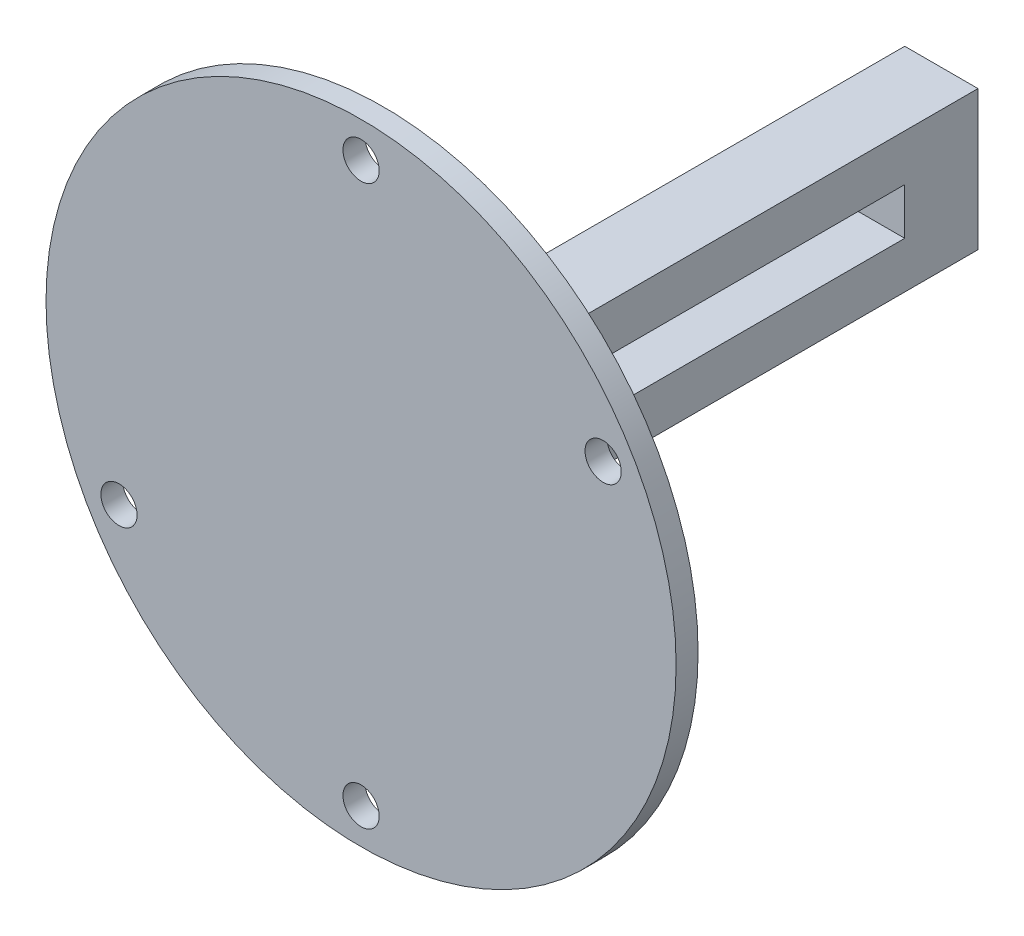
ISO-10303-21;
HEADER;
FILE_DESCRIPTION(('STEP AP214'),'2;1');
FILE_NAME('part.step','',(''),(''),'','','');
FILE_SCHEMA(('AUTOMOTIVE_DESIGN { 1 0 10303 214 1 1 1 1 }'));
ENDSEC;
DATA;
#1=APPLICATION_CONTEXT('core data for automotive mechanical design processes');
#2=APPLICATION_PROTOCOL_DEFINITION('international standard','automotive_design',2000,#1);
#3=PRODUCT_CONTEXT('',#1,'mechanical');
#4=PRODUCT('Part','Part','',(#3));
#5=PRODUCT_RELATED_PRODUCT_CATEGORY('part','',(#4));
#6=PRODUCT_DEFINITION_FORMATION('','',#4);
#7=PRODUCT_DEFINITION_CONTEXT('part definition',#1,'design');
#8=PRODUCT_DEFINITION('design','',#6,#7);
#9=PRODUCT_DEFINITION_SHAPE('','',#8);
#10=(LENGTH_UNIT() NAMED_UNIT(*) SI_UNIT(.MILLI.,.METRE.));
#11=(NAMED_UNIT(*) PLANE_ANGLE_UNIT() SI_UNIT($,.RADIAN.));
#12=(NAMED_UNIT(*) SI_UNIT($,.STERADIAN.) SOLID_ANGLE_UNIT());
#13=UNCERTAINTY_MEASURE_WITH_UNIT(LENGTH_MEASURE(1.E-05),#10,'distance_accuracy_value','');
#14=(GEOMETRIC_REPRESENTATION_CONTEXT(3) GLOBAL_UNCERTAINTY_ASSIGNED_CONTEXT((#13)) GLOBAL_UNIT_ASSIGNED_CONTEXT((#10,
#11,#12)) REPRESENTATION_CONTEXT('',''));
#15=CARTESIAN_POINT('',(0.,0.,0.));
#16=DIRECTION('',(0.,0.,1.));
#17=DIRECTION('',(1.,0.,0.));
#18=AXIS2_PLACEMENT_3D('',#15,#16,#17);
#19=CARTESIAN_POINT('',(0.,0.,-9.55095364318076));
#20=DIRECTION('',(0.,0.,-1.));
#21=DIRECTION('',(-1.,0.,0.));
#22=AXIS2_PLACEMENT_3D('',#19,#20,#21);
#23=PLANE('',#22);
#24=CARTESIAN_POINT('',(-35.5183544581319,47.4135294711595,-9.55095364318076));
#25=DIRECTION('',(0.,0.,1.));
#26=DIRECTION('',(1.,0.,0.));
#27=AXIS2_PLACEMENT_3D('',#24,#25,#26);
#28=CIRCLE('',#27,2.4732);
#29=CARTESIAN_POINT('',(-33.0451544581319,47.4135294711595,-9.55095364318076));
#30=VERTEX_POINT('',#29);
#31=EDGE_CURVE('E374',#30,#30,#28,.T.);
#32=ORIENTED_EDGE('',*,*,#31,.T.);
#33=EDGE_LOOP('',(#32));
#34=FACE_BOUND('',#33,.T.);
#35=CARTESIAN_POINT('',(-2.47948530375584,28.3385294711599,-9.55095364318076));
#36=DIRECTION('',(0.,0.,1.));
#37=DIRECTION('',(1.,0.,0.));
#38=AXIS2_PLACEMENT_3D('',#35,#36,#37);
#39=CIRCLE('',#38,2.4732);
#40=CARTESIAN_POINT('',(-0.00628530375583513,28.3385294711599,-9.55095364318076));
#41=VERTEX_POINT('',#40);
#42=EDGE_CURVE('E381',#41,#41,#39,.T.);
#43=ORIENTED_EDGE('',*,*,#42,.T.);
#44=EDGE_LOOP('',(#43));
#45=FACE_BOUND('',#44,.T.);
#46=CARTESIAN_POINT('',(-68.5572236125082,-9.81147052884069,-9.55095364318076));
#47=DIRECTION('',(0.,0.,1.));
#48=DIRECTION('',(1.,0.,0.));
#49=AXIS2_PLACEMENT_3D('',#46,#47,#48);
#50=CIRCLE('',#49,2.4732);
#51=CARTESIAN_POINT('',(-66.0840236125082,-9.81147052884069,-9.55095364318076));
#52=VERTEX_POINT('',#51);
#53=EDGE_CURVE('E391',#52,#52,#50,.T.);
#54=ORIENTED_EDGE('',*,*,#53,.T.);
#55=EDGE_LOOP('',(#54));
#56=FACE_BOUND('',#55,.T.);
#57=CARTESIAN_POINT('',(-35.518354458132,-28.8864705288405,-9.55095364318076));
#58=DIRECTION('',(0.,0.,1.));
#59=DIRECTION('',(1.,0.,0.));
#60=AXIS2_PLACEMENT_3D('',#57,#58,#59);
#61=CIRCLE('',#60,2.4732);
#62=CARTESIAN_POINT('',(-33.0451544581319,-28.8864705288405,-9.55095364318076));
#63=VERTEX_POINT('',#62);
#64=EDGE_CURVE('E399',#63,#63,#61,.T.);
#65=ORIENTED_EDGE('',*,*,#64,.T.);
#66=EDGE_LOOP('',(#65));
#67=FACE_BOUND('',#66,.T.);
#68=DIRECTION('',(0.,1.,0.));
#69=VECTOR('',#68,1.);
#70=CARTESIAN_POINT('',(-53.2183544581319,0.,-9.55095364318076));
#71=LINE('',#70,#69);
#72=CARTESIAN_POINT('',(-53.2183544581319,31.4885294711595,-9.55095364318076));
#73=VERTEX_POINT('',#72);
#74=CARTESIAN_POINT('',(-53.2183544581319,-12.9614705288405,-9.55095364318076));
#75=VERTEX_POINT('',#74);
#76=EDGE_CURVE('E230',#73,#75,#71,.F.);
#77=ORIENTED_EDGE('',*,*,#76,.T.);
#78=DIRECTION('',(1.,0.,0.));
#79=VECTOR('',#78,1.);
#80=CARTESIAN_POINT('',(-30.5183544581319,-12.9614705288405,-9.55095364318076));
#81=LINE('',#80,#79);
#82=CARTESIAN_POINT('',(-17.8183544581319,-12.9614705288405,-9.55095364318076));
#83=VERTEX_POINT('',#82);
#84=EDGE_CURVE('E234',#75,#83,#81,.T.);
#85=ORIENTED_EDGE('',*,*,#84,.T.);
#86=DIRECTION('',(0.,1.,0.));
#87=VECTOR('',#86,1.);
#88=CARTESIAN_POINT('',(-17.8183544581319,18.7885294711595,-9.55095364318076));
#89=LINE('',#88,#87);
#90=CARTESIAN_POINT('',(-17.8183544581319,31.4885294711595,-9.55095364318076));
#91=VERTEX_POINT('',#90);
#92=EDGE_CURVE('E227',#83,#91,#89,.T.);
#93=ORIENTED_EDGE('',*,*,#92,.T.);
#94=DIRECTION('',(1.,0.,0.));
#95=VECTOR('',#94,1.);
#96=CARTESIAN_POINT('',(0.,31.4885294711595,-9.55095364318076));
#97=LINE('',#96,#95);
#98=EDGE_CURVE('E224',#91,#73,#97,.F.);
#99=ORIENTED_EDGE('',*,*,#98,.T.);
#100=EDGE_LOOP('',(#77,#85,#93,#99));
#101=FACE_BOUND('',#100,.T.);
#102=CARTESIAN_POINT('',(-35.518354458132,9.26352947115947,-9.55095364318076));
#103=DIRECTION('',(0.,0.,-1.));
#104=DIRECTION('',(-1.,0.,0.));
#105=AXIS2_PLACEMENT_3D('',#102,#103,#104);
#106=CIRCLE('',#105,43.);
#107=CARTESIAN_POINT('',(-78.518354458132,9.26352947115947,-9.55095364318076));
#108=VERTEX_POINT('',#107);
#109=EDGE_CURVE('E212',#108,#108,#106,.F.);
#110=ORIENTED_EDGE('',*,*,#109,.F.);
#111=EDGE_LOOP('',(#110));
#112=FACE_BOUND('',#111,.T.);
#113=ADVANCED_FACE('F43',(#34,#45,#56,#67,#101,#112),#23,.T.);
#114=CARTESIAN_POINT('',(-35.518354458132,9.26352947115947,-9.55095364318076));
#115=DIRECTION('',(0.,0.,1.));
#116=DIRECTION('',(1.,0.,0.));
#117=AXIS2_PLACEMENT_3D('',#114,#115,#116);
#118=CYLINDRICAL_SURFACE('',#117,43.);
#119=ORIENTED_EDGE('',*,*,#109,.T.);
#120=EDGE_LOOP('',(#119));
#121=FACE_BOUND('',#120,.T.);
#122=CARTESIAN_POINT('',(-35.518354458132,9.26352947115947,-6.55095364318076));
#123=DIRECTION('',(0.,0.,-1.));
#124=DIRECTION('',(-1.,0.,0.));
#125=AXIS2_PLACEMENT_3D('',#122,#123,#124);
#126=CIRCLE('',#125,43.);
#127=CARTESIAN_POINT('',(-78.518354458132,9.26352947115947,-6.55095364318076));
#128=VERTEX_POINT('',#127);
#129=EDGE_CURVE('E205',#128,#128,#126,.F.);
#130=ORIENTED_EDGE('',*,*,#129,.F.);
#131=EDGE_LOOP('',(#130));
#132=FACE_BOUND('',#131,.T.);
#133=ADVANCED_FACE('F306',(#121,#132),#118,.T.);
#134=CARTESIAN_POINT('',(0.,0.,-6.55095364318076));
#135=DIRECTION('',(0.,0.,-1.));
#136=DIRECTION('',(-1.,0.,0.));
#137=AXIS2_PLACEMENT_3D('',#134,#135,#136);
#138=PLANE('',#137);
#139=CARTESIAN_POINT('',(-35.5183544581319,47.4135294711595,-6.55095364318076));
#140=DIRECTION('',(0.,0.,-1.));
#141=DIRECTION('',(-1.,0.,0.));
#142=AXIS2_PLACEMENT_3D('',#139,#140,#141);
#143=CIRCLE('',#142,2.4732);
#144=CARTESIAN_POINT('',(-37.9915544581319,47.4135294711595,-6.55095364318076));
#145=VERTEX_POINT('',#144);
#146=EDGE_CURVE('E376',#145,#145,#143,.T.);
#147=ORIENTED_EDGE('',*,*,#146,.T.);
#148=EDGE_LOOP('',(#147));
#149=FACE_BOUND('',#148,.T.);
#150=CARTESIAN_POINT('',(-2.47948530375584,28.3385294711599,-6.55095364318076));
#151=DIRECTION('',(0.,0.,-1.));
#152=DIRECTION('',(-1.,0.,0.));
#153=AXIS2_PLACEMENT_3D('',#150,#151,#152);
#154=CIRCLE('',#153,2.4732);
#155=CARTESIAN_POINT('',(-4.95268530375584,28.3385294711599,-6.55095364318076));
#156=VERTEX_POINT('',#155);
#157=EDGE_CURVE('E387',#156,#156,#154,.T.);
#158=ORIENTED_EDGE('',*,*,#157,.T.);
#159=EDGE_LOOP('',(#158));
#160=FACE_BOUND('',#159,.T.);
#161=CARTESIAN_POINT('',(-68.5572236125082,-9.81147052884069,-6.55095364318076));
#162=DIRECTION('',(0.,0.,-1.));
#163=DIRECTION('',(-1.,0.,0.));
#164=AXIS2_PLACEMENT_3D('',#161,#162,#163);
#165=CIRCLE('',#164,2.4732);
#166=CARTESIAN_POINT('',(-71.0304236125082,-9.81147052884069,-6.55095364318076));
#167=VERTEX_POINT('',#166);
#168=EDGE_CURVE('E395',#167,#167,#165,.T.);
#169=ORIENTED_EDGE('',*,*,#168,.T.);
#170=EDGE_LOOP('',(#169));
#171=FACE_BOUND('',#170,.T.);
#172=CARTESIAN_POINT('',(-35.518354458132,-28.8864705288405,-6.55095364318076));
#173=DIRECTION('',(0.,0.,-1.));
#174=DIRECTION('',(-1.,0.,0.));
#175=AXIS2_PLACEMENT_3D('',#172,#173,#174);
#176=CIRCLE('',#175,2.4732);
#177=CARTESIAN_POINT('',(-37.991554458132,-28.8864705288405,-6.55095364318076));
#178=VERTEX_POINT('',#177);
#179=EDGE_CURVE('E403',#178,#178,#176,.T.);
#180=ORIENTED_EDGE('',*,*,#179,.T.);
#181=EDGE_LOOP('',(#180));
#182=FACE_BOUND('',#181,.T.);
#183=ORIENTED_EDGE('',*,*,#129,.T.);
#184=EDGE_LOOP('',(#183));
#185=FACE_BOUND('',#184,.T.);
#186=ADVANCED_FACE('F312',(#149,#160,#171,#182,#185),#138,.F.);
#187=CARTESIAN_POINT('',(-40.5183544581319,6.08852947115948,0.));
#188=DIRECTION('',(0.,-1.,0.));
#189=DIRECTION('',(0.,0.,-1.));
#190=AXIS2_PLACEMENT_3D('',#187,#188,#189);
#191=PLANE('',#190);
#192=DIRECTION('',(0.,0.,-1.));
#193=VECTOR('',#192,1.);
#194=CARTESIAN_POINT('',(-40.5183544581319,6.08852947115948,0.));
#195=LINE('',#194,#193);
#196=CARTESIAN_POINT('',(-40.5183544581319,6.08852947115948,-22.7259536431807));
#197=VERTEX_POINT('',#196);
#198=CARTESIAN_POINT('',(-40.5183544581319,6.08852947115947,-75.7509536431808));
#199=VERTEX_POINT('',#198);
#200=EDGE_CURVE('E164',#197,#199,#195,.T.);
#201=ORIENTED_EDGE('',*,*,#200,.F.);
#202=DIRECTION('',(1.,0.,0.));
#203=VECTOR('',#202,1.);
#204=CARTESIAN_POINT('',(-40.5183544581319,6.08852947115948,-22.7259536431807));
#205=LINE('',#204,#203);
#206=CARTESIAN_POINT('',(-30.5183544581319,6.08852947115948,-22.7259536431807));
#207=VERTEX_POINT('',#206);
#208=EDGE_CURVE('E247',#197,#207,#205,.T.);
#209=ORIENTED_EDGE('',*,*,#208,.T.);
#210=DIRECTION('',(0.,0.,-1.));
#211=VECTOR('',#210,1.);
#212=CARTESIAN_POINT('',(-30.5183544581319,6.08852947115948,0.));
#213=LINE('',#212,#211);
#214=CARTESIAN_POINT('',(-30.5183544581319,6.08852947115947,-75.7509536431808));
#215=VERTEX_POINT('',#214);
#216=EDGE_CURVE('E198',#207,#215,#213,.T.);
#217=ORIENTED_EDGE('',*,*,#216,.T.);
#218=DIRECTION('',(1.,0.,0.));
#219=VECTOR('',#218,1.);
#220=CARTESIAN_POINT('',(-40.5183544581319,6.08852947115947,-75.7509536431808));
#221=LINE('',#220,#219);
#222=EDGE_CURVE('E201',#199,#215,#221,.T.);
#223=ORIENTED_EDGE('',*,*,#222,.F.);
#224=EDGE_LOOP('',(#201,#209,#217,#223));
#225=FACE_BOUND('',#224,.T.);
#226=ADVANCED_FACE('F322',(#225),#191,.F.);
#227=CARTESIAN_POINT('',(-40.5183544581319,0.,-75.7509536431808));
#228=DIRECTION('',(0.,0.,-1.));
#229=DIRECTION('',(-1.,0.,0.));
#230=AXIS2_PLACEMENT_3D('',#227,#228,#229);
#231=PLANE('',#230);
#232=DIRECTION('',(0.,1.,0.));
#233=VECTOR('',#232,1.);
#234=CARTESIAN_POINT('',(-30.5183544581319,0.,-75.7509536431808));
#235=LINE('',#234,#233);
#236=CARTESIAN_POINT('',(-30.5183544581319,12.4385294711595,-75.7509536431808));
#237=VERTEX_POINT('',#236);
#238=EDGE_CURVE('E194',#215,#237,#235,.T.);
#239=ORIENTED_EDGE('',*,*,#238,.T.);
#240=DIRECTION('',(1.,0.,0.));
#241=VECTOR('',#240,1.);
#242=CARTESIAN_POINT('',(-40.5183544581319,12.4385294711595,-75.7509536431808));
#243=LINE('',#242,#241);
#244=CARTESIAN_POINT('',(-40.5183544581319,12.4385294711595,-75.7509536431808));
#245=VERTEX_POINT('',#244);
#246=EDGE_CURVE('E206',#245,#237,#243,.T.);
#247=ORIENTED_EDGE('',*,*,#246,.F.);
#248=DIRECTION('',(0.,1.,0.));
#249=VECTOR('',#248,1.);
#250=CARTESIAN_POINT('',(-40.5183544581319,0.,-75.7509536431808));
#251=LINE('',#250,#249);
#252=EDGE_CURVE('E173',#199,#245,#251,.T.);
#253=ORIENTED_EDGE('',*,*,#252,.F.);
#254=ORIENTED_EDGE('',*,*,#222,.T.);
#255=EDGE_LOOP('',(#239,#247,#253,#254));
#256=FACE_BOUND('',#255,.T.);
#257=ADVANCED_FACE('F366',(#256),#231,.F.);
#258=CARTESIAN_POINT('',(-40.5183544581319,18.7885294711594,0.));
#259=DIRECTION('',(0.,-1.,0.));
#260=DIRECTION('',(0.,0.,-1.));
#261=AXIS2_PLACEMENT_3D('',#258,#259,#260);
#262=PLANE('',#261);
#263=DIRECTION('',(0.,0.,-1.));
#264=VECTOR('',#263,1.);
#265=CARTESIAN_POINT('',(-40.5183544581319,18.7885294711594,0.));
#266=LINE('',#265,#264);
#267=CARTESIAN_POINT('',(-40.5183544581319,18.7885294711594,-22.2509536431808));
#268=VERTEX_POINT('',#267);
#269=CARTESIAN_POINT('',(-40.5183544581319,18.7885294711595,-85.7509536431808));
#270=VERTEX_POINT('',#269);
#271=EDGE_CURVE('E154',#268,#270,#266,.T.);
#272=ORIENTED_EDGE('',*,*,#271,.F.);
#273=DIRECTION('',(1.,0.,0.));
#274=VECTOR('',#273,1.);
#275=CARTESIAN_POINT('',(-40.5183544581319,18.7885294711594,-22.2509536431808));
#276=LINE('',#275,#274);
#277=CARTESIAN_POINT('',(-30.5183544581319,18.7885294711594,-22.2509536431808));
#278=VERTEX_POINT('',#277);
#279=EDGE_CURVE('E244',#268,#278,#276,.T.);
#280=ORIENTED_EDGE('',*,*,#279,.T.);
#281=DIRECTION('',(0.,0.,-1.));
#282=VECTOR('',#281,1.);
#283=CARTESIAN_POINT('',(-30.5183544581319,18.7885294711594,0.));
#284=LINE('',#283,#282);
#285=CARTESIAN_POINT('',(-30.5183544581319,18.7885294711595,-85.7509536431808));
#286=VERTEX_POINT('',#285);
#287=EDGE_CURVE('E182',#278,#286,#284,.T.);
#288=ORIENTED_EDGE('',*,*,#287,.T.);
#289=DIRECTION('',(1.,0.,0.));
#290=VECTOR('',#289,1.);
#291=CARTESIAN_POINT('',(-40.5183544581319,18.7885294711595,-85.7509536431808));
#292=LINE('',#291,#290);
#293=EDGE_CURVE('E163',#270,#286,#292,.T.);
#294=ORIENTED_EDGE('',*,*,#293,.F.);
#295=EDGE_LOOP('',(#272,#280,#288,#294));
#296=FACE_BOUND('',#295,.T.);
#297=ADVANCED_FACE('F319',(#296),#262,.F.);
#298=CARTESIAN_POINT('',(-40.5183544581319,0.,-85.7509536431808));
#299=DIRECTION('',(0.,0.,-1.));
#300=DIRECTION('',(-1.,0.,0.));
#301=AXIS2_PLACEMENT_3D('',#298,#299,#300);
#302=PLANE('',#301);
#303=DIRECTION('',(0.,1.,0.));
#304=VECTOR('',#303,1.);
#305=CARTESIAN_POINT('',(-30.5183544581319,0.,-85.7509536431808));
#306=LINE('',#305,#304);
#307=CARTESIAN_POINT('',(-30.5183544581319,-0.261470528840534,-85.7509536431808));
#308=VERTEX_POINT('',#307);
#309=EDGE_CURVE('E161',#308,#286,#306,.T.);
#310=ORIENTED_EDGE('',*,*,#309,.F.);
#311=DIRECTION('',(1.,0.,0.));
#312=VECTOR('',#311,1.);
#313=CARTESIAN_POINT('',(-40.5183544581319,-0.261470528840534,-85.7509536431808));
#314=LINE('',#313,#312);
#315=CARTESIAN_POINT('',(-40.5183544581319,-0.261470528840534,-85.7509536431808));
#316=VERTEX_POINT('',#315);
#317=EDGE_CURVE('E145',#316,#308,#314,.T.);
#318=ORIENTED_EDGE('',*,*,#317,.F.);
#319=DIRECTION('',(0.,1.,0.));
#320=VECTOR('',#319,1.);
#321=CARTESIAN_POINT('',(-40.5183544581319,0.,-85.7509536431808));
#322=LINE('',#321,#320);
#323=EDGE_CURVE('E153',#316,#270,#322,.T.);
#324=ORIENTED_EDGE('',*,*,#323,.T.);
#325=ORIENTED_EDGE('',*,*,#293,.T.);
#326=EDGE_LOOP('',(#310,#318,#324,#325));
#327=FACE_BOUND('',#326,.T.);
#328=ADVANCED_FACE('F158',(#327),#302,.T.);
#329=CARTESIAN_POINT('',(-40.5183544581319,-0.261470528840534,0.));
#330=DIRECTION('',(0.,-1.,0.));
#331=DIRECTION('',(0.,0.,-1.));
#332=AXIS2_PLACEMENT_3D('',#329,#330,#331);
#333=PLANE('',#332);
#334=DIRECTION('',(0.,0.,-1.));
#335=VECTOR('',#334,1.);
#336=CARTESIAN_POINT('',(-30.5183544581319,-0.261470528840534,0.));
#337=LINE('',#336,#335);
#338=CARTESIAN_POINT('',(-30.5183544581319,-0.261470528840534,-22.2509536431808));
#339=VERTEX_POINT('',#338);
#340=EDGE_CURVE('E185',#339,#308,#337,.T.);
#341=ORIENTED_EDGE('',*,*,#340,.F.);
#342=DIRECTION('',(1.,0.,0.));
#343=VECTOR('',#342,1.);
#344=CARTESIAN_POINT('',(-40.5183544581319,-0.261470528840534,-22.2509536431808));
#345=LINE('',#344,#343);
#346=CARTESIAN_POINT('',(-40.5183544581319,-0.261470528840534,-22.2509536431808));
#347=VERTEX_POINT('',#346);
#348=EDGE_CURVE('E148',#339,#347,#345,.F.);
#349=ORIENTED_EDGE('',*,*,#348,.T.);
#350=DIRECTION('',(0.,0.,-1.));
#351=VECTOR('',#350,1.);
#352=CARTESIAN_POINT('',(-40.5183544581319,-0.261470528840534,0.));
#353=LINE('',#352,#351);
#354=EDGE_CURVE('E141',#347,#316,#353,.T.);
#355=ORIENTED_EDGE('',*,*,#354,.T.);
#356=ORIENTED_EDGE('',*,*,#317,.T.);
#357=EDGE_LOOP('',(#341,#349,#355,#356));
#358=FACE_BOUND('',#357,.T.);
#359=ADVANCED_FACE('F144',(#358),#333,.T.);
#360=CARTESIAN_POINT('',(-40.5183544581319,12.4385294711595,0.));
#361=DIRECTION('',(0.,-1.,0.));
#362=DIRECTION('',(0.,0.,-1.));
#363=AXIS2_PLACEMENT_3D('',#360,#361,#362);
#364=PLANE('',#363);
#365=DIRECTION('',(0.,0.,-1.));
#366=VECTOR('',#365,1.);
#367=CARTESIAN_POINT('',(-30.5183544581319,12.4385294711595,0.));
#368=LINE('',#367,#366);
#369=CARTESIAN_POINT('',(-30.5183544581319,12.4385294711595,-22.7259536431807));
#370=VERTEX_POINT('',#369);
#371=EDGE_CURVE('E191',#370,#237,#368,.T.);
#372=ORIENTED_EDGE('',*,*,#371,.F.);
#373=DIRECTION('',(1.,0.,0.));
#374=VECTOR('',#373,1.);
#375=CARTESIAN_POINT('',(-40.8086808121411,12.4385294711595,-22.7259536431807));
#376=LINE('',#375,#374);
#377=CARTESIAN_POINT('',(-40.5183544581319,12.4385294711595,-22.7259536431807));
#378=VERTEX_POINT('',#377);
#379=EDGE_CURVE('E264',#370,#378,#376,.F.);
#380=ORIENTED_EDGE('',*,*,#379,.T.);
#381=DIRECTION('',(0.,0.,-1.));
#382=VECTOR('',#381,1.);
#383=CARTESIAN_POINT('',(-40.5183544581319,12.4385294711595,0.));
#384=LINE('',#383,#382);
#385=EDGE_CURVE('E170',#378,#245,#384,.T.);
#386=ORIENTED_EDGE('',*,*,#385,.T.);
#387=ORIENTED_EDGE('',*,*,#246,.T.);
#388=EDGE_LOOP('',(#372,#380,#386,#387));
#389=FACE_BOUND('',#388,.T.);
#390=ADVANCED_FACE('F428',(#389),#364,.T.);
#391=CARTESIAN_POINT('',(-40.5183544581319,0.,0.));
#392=DIRECTION('',(1.,0.,0.));
#393=DIRECTION('',(0.,0.,-1.));
#394=AXIS2_PLACEMENT_3D('',#391,#392,#393);
#395=PLANE('',#394);
#396=ORIENTED_EDGE('',*,*,#354,.F.);
#397=DIRECTION('',(0.,1.,0.));
#398=VECTOR('',#397,1.);
#399=CARTESIAN_POINT('',(-40.5183544581319,0.,-22.2509536431808));
#400=LINE('',#399,#398);
#401=CARTESIAN_POINT('',(-40.5183544581319,6.12426204069103,-22.2509536431808));
#402=VERTEX_POINT('',#401);
#403=EDGE_CURVE('E221',#347,#402,#400,.T.);
#404=ORIENTED_EDGE('',*,*,#403,.T.);
#405=CARTESIAN_POINT('',(-40.5183544581319,9.26352947115948,-22.7259536431807));
#406=DIRECTION('',(1.,0.,0.));
#407=DIRECTION('',(0.,0.,-1.));
#408=AXIS2_PLACEMENT_3D('',#405,#406,#407);
#409=CIRCLE('',#408,3.175);
#410=EDGE_CURVE('E345',#402,#197,#409,.T.);
#411=ORIENTED_EDGE('',*,*,#410,.T.);
#412=ORIENTED_EDGE('',*,*,#200,.T.);
#413=ORIENTED_EDGE('',*,*,#252,.T.);
#414=ORIENTED_EDGE('',*,*,#385,.F.);
#415=CARTESIAN_POINT('',(-40.5183544581319,9.26352947115947,-22.7259536431807));
#416=DIRECTION('',(1.,0.,0.));
#417=DIRECTION('',(0.,0.,-1.));
#418=AXIS2_PLACEMENT_3D('',#415,#416,#417);
#419=CIRCLE('',#418,3.175);
#420=CARTESIAN_POINT('',(-40.5183544581319,12.4027969016279,-22.2509536431808));
#421=VERTEX_POINT('',#420);
#422=EDGE_CURVE('E54',#378,#421,#419,.T.);
#423=ORIENTED_EDGE('',*,*,#422,.T.);
#424=DIRECTION('',(0.,1.,0.));
#425=VECTOR('',#424,1.);
#426=CARTESIAN_POINT('',(-40.5183544581319,0.,-22.2509536431808));
#427=LINE('',#426,#425);
#428=EDGE_CURVE('E60',#421,#268,#427,.T.);
#429=ORIENTED_EDGE('',*,*,#428,.T.);
#430=ORIENTED_EDGE('',*,*,#271,.T.);
#431=ORIENTED_EDGE('',*,*,#323,.F.);
#432=EDGE_LOOP('',(#396,#404,#411,#412,#413,#414,#423,#429,#430,#431));
#433=FACE_BOUND('',#432,.T.);
#434=ADVANCED_FACE('F166',(#433),#395,.F.);
#435=CARTESIAN_POINT('',(-30.5183544581319,0.,0.));
#436=DIRECTION('',(1.,0.,0.));
#437=DIRECTION('',(0.,0.,-1.));
#438=AXIS2_PLACEMENT_3D('',#435,#436,#437);
#439=PLANE('',#438);
#440=ORIENTED_EDGE('',*,*,#287,.F.);
#441=DIRECTION('',(0.,1.,0.));
#442=VECTOR('',#441,1.);
#443=CARTESIAN_POINT('',(-30.5183544581319,-0.261470528840534,-22.2509536431808));
#444=LINE('',#443,#442);
#445=CARTESIAN_POINT('',(-30.5183544581319,12.4027969016279,-22.2509536431808));
#446=VERTEX_POINT('',#445);
#447=EDGE_CURVE('E68',#278,#446,#444,.F.);
#448=ORIENTED_EDGE('',*,*,#447,.T.);
#449=CARTESIAN_POINT('',(-30.5183544581319,9.26352947115947,-22.7259536431807));
#450=DIRECTION('',(1.,0.,0.));
#451=DIRECTION('',(0.,0.,-1.));
#452=AXIS2_PLACEMENT_3D('',#449,#450,#451);
#453=CIRCLE('',#452,3.175);
#454=EDGE_CURVE('E336',#446,#370,#453,.F.);
#455=ORIENTED_EDGE('',*,*,#454,.T.);
#456=ORIENTED_EDGE('',*,*,#371,.T.);
#457=ORIENTED_EDGE('',*,*,#238,.F.);
#458=ORIENTED_EDGE('',*,*,#216,.F.);
#459=CARTESIAN_POINT('',(-30.5183544581319,9.26352947115948,-22.7259536431807));
#460=DIRECTION('',(1.,0.,0.));
#461=DIRECTION('',(0.,0.,-1.));
#462=AXIS2_PLACEMENT_3D('',#459,#460,#461);
#463=CIRCLE('',#462,3.175);
#464=CARTESIAN_POINT('',(-30.5183544581319,6.12426204069103,-22.2509536431808));
#465=VERTEX_POINT('',#464);
#466=EDGE_CURVE('E267',#207,#465,#463,.F.);
#467=ORIENTED_EDGE('',*,*,#466,.T.);
#468=DIRECTION('',(0.,1.,0.));
#469=VECTOR('',#468,1.);
#470=CARTESIAN_POINT('',(-30.5183544581319,-0.261470528840534,-22.2509536431808));
#471=LINE('',#470,#469);
#472=EDGE_CURVE('E237',#465,#339,#471,.F.);
#473=ORIENTED_EDGE('',*,*,#472,.T.);
#474=ORIENTED_EDGE('',*,*,#340,.T.);
#475=ORIENTED_EDGE('',*,*,#309,.T.);
#476=EDGE_LOOP('',(#440,#448,#455,#456,#457,#458,#467,#473,#474,#475));
#477=FACE_BOUND('',#476,.T.);
#478=ADVANCED_FACE('F361',(#477),#439,.T.);
#479=CARTESIAN_POINT('',(-17.8183544581319,0.,-22.2509536431808));
#480=DIRECTION('',(0.,-1.,0.));
#481=DIRECTION('',(0.,0.,-1.));
#482=AXIS2_PLACEMENT_3D('',#479,#480,#481);
#483=CYLINDRICAL_SURFACE('',#482,12.7);
#484=CARTESIAN_POINT('',(-17.8183544581319,31.4885294711595,-22.2509536431808));
#485=DIRECTION('',(0.707106781186547,-0.707106781186547,0.));
#486=DIRECTION('',(0.707106781186547,0.707106781186547,0.));
#487=AXIS2_PLACEMENT_3D('',#484,#485,#486);
#488=ELLIPSE('',#487,17.9605122421383,12.7);
#489=EDGE_CURVE('E254',#91,#278,#488,.T.);
#490=ORIENTED_EDGE('',*,*,#489,.F.);
#491=ORIENTED_EDGE('',*,*,#92,.F.);
#492=CARTESIAN_POINT('',(-17.8183544581319,-12.9614705288405,-22.2509536431808));
#493=DIRECTION('',(-0.707106781186547,-0.707106781186547,0.));
#494=DIRECTION('',(-0.707106781186547,0.707106781186547,0.));
#495=AXIS2_PLACEMENT_3D('',#492,#493,#494);
#496=ELLIPSE('',#495,17.9605122421383,12.7);
#497=EDGE_CURVE('E186',#339,#83,#496,.F.);
#498=ORIENTED_EDGE('',*,*,#497,.F.);
#499=ORIENTED_EDGE('',*,*,#472,.F.);
#500=CARTESIAN_POINT('',(-30.5183544581319,6.12426204069103,-22.2509536431808));
#501=CARTESIAN_POINT('',(-30.5183625051942,6.13745240720999,-22.1637126307269));
#502=CARTESIAN_POINT('',(-30.5174556822332,6.15429767149809,-22.0770318256751));
#503=CARTESIAN_POINT('',(-30.5139409438548,6.19512462473372,-21.9054179163034));
#504=CARTESIAN_POINT('',(-30.5113333250518,6.21910506892788,-21.8204845099055));
#505=CARTESIAN_POINT('',(-30.5045513071736,6.27398718771343,-21.6531037791261));
#506=CARTESIAN_POINT('',(-30.5003795706789,6.30487706460666,-21.5706524856939));
#507=CARTESIAN_POINT('',(-30.4906540203071,6.37334471476437,-21.4086845101194));
#508=CARTESIAN_POINT('',(-30.4851001814759,6.4109226087788,-21.3291678809928));
#509=CARTESIAN_POINT('',(-30.4666745970344,6.53329315753257,-21.0958606401426));
#510=CARTESIAN_POINT('',(-30.4520314371998,6.62777685396137,-20.9471482045332));
#511=CARTESIAN_POINT('',(-30.4200559969548,6.83976312890074,-20.6676028546346));
#512=CARTESIAN_POINT('',(-30.4027233897358,6.95726850535007,-20.5367721168809));
#513=CARTESIAN_POINT('',(-30.3673264291137,7.21431078528005,-20.2942797641461));
#514=CARTESIAN_POINT('',(-30.3492547267384,7.3541785347311,-20.1829691746282));
#515=CARTESIAN_POINT('',(-30.3150167987317,7.65083181616198,-19.9852203180901));
#516=CARTESIAN_POINT('',(-30.298851492901,7.80762544525237,-19.8987940285287));
#517=CARTESIAN_POINT('',(-30.2705009385307,8.13456234059961,-19.7530320511196));
#518=CARTESIAN_POINT('',(-30.2583350488099,8.30476573471433,-19.693827593335));
#519=CARTESIAN_POINT('',(-30.2397668739808,8.65284239344328,-19.6050865556377));
#520=CARTESIAN_POINT('',(-30.23335297707,8.83069944268542,-19.5754901905326));
#521=CARTESIAN_POINT('',(-30.2295010221606,9.05182621249891,-19.5577334799935));
#522=CARTESIAN_POINT('',(-30.2289488922191,9.09415572587631,-19.555189931473));
#523=CARTESIAN_POINT('',(-30.2282131326392,9.17882821369744,-19.5518023896415));
#524=CARTESIAN_POINT('',(-30.2280290022214,9.22117109131697,-19.550956086687));
#525=CARTESIAN_POINT('',(-30.2280281041228,9.26352947115948,-19.5509536431807));
#526=B_SPLINE_CURVE_WITH_KNOTS('',3,(#500,#501,#502,#503,#504,#505,#506,#507,#508,#509,#510,
#511,#512,#513,#514,#515,#516,#517,#518,#519,#520,#521,#522,#523,#524,#525),.UNSPECIFIED.,.F.,
.F.,(4,2,2,2,2,2,2,2,2,2,2,2,4),(0.,0.264603985432967,0.529161836951693,0.793271364306853,
1.05738566055618,1.5851008183421,2.11288015179412,2.64934798126384,3.18607359659181,
3.72536018995164,4.26355563480008,4.39076414160217,4.51779942291054),.UNSPECIFIED.);
#527=CARTESIAN_POINT('',(-30.2280281041228,9.26352947115948,-19.5509536431807));
#528=VERTEX_POINT('',#527);
#529=EDGE_CURVE('E271',#465,#528,#526,.T.);
#530=ORIENTED_EDGE('',*,*,#529,.T.);
#531=CARTESIAN_POINT('',(-30.2280281041228,9.26352947115947,-19.5509536431807));
#532=CARTESIAN_POINT('',(-30.2280188337141,9.35181176993996,-19.5509439019334));
#533=CARTESIAN_POINT('',(-30.2288290176768,9.44008846291661,-19.5546356124315));
#534=CARTESIAN_POINT('',(-30.2320197313887,9.61598860358182,-19.5693462770196));
#535=CARTESIAN_POINT('',(-30.2344000405497,9.70361214128426,-19.5803642018444));
#536=CARTESIAN_POINT('',(-30.2406573812158,9.87744751129285,-19.6096278406826));
#537=CARTESIAN_POINT('',(-30.2445319703818,9.96366140914503,-19.6278617617122));
#538=CARTESIAN_POINT('',(-30.2536415529315,10.1341888856594,-19.6713945084506));
#539=CARTESIAN_POINT('',(-30.2588765570976,10.2185024492543,-19.6966933901549));
#540=CARTESIAN_POINT('',(-30.2763782272481,10.4677205557169,-19.7829311891289));
#541=CARTESIAN_POINT('',(-30.2904472398354,10.6290483121587,-19.8542360017686));
#542=CARTESIAN_POINT('',(-30.3215713018674,10.9374047072987,-20.0223162597922));
#543=CARTESIAN_POINT('',(-30.3386265944593,11.0844321801297,-20.119093779524));
#544=CARTESIAN_POINT('',(-30.3738086956856,11.362469384274,-20.3370813626273));
#545=CARTESIAN_POINT('',(-30.3919473925748,11.4932181466041,-20.4586230007329));
#546=CARTESIAN_POINT('',(-30.4266900858712,11.7326934492352,-20.7220685634211));
#547=CARTESIAN_POINT('',(-30.4432932668637,11.8414083248358,-20.8639832058787));
#548=CARTESIAN_POINT('',(-30.4727801833879,12.0343270944565,-21.1653283235613));
#549=CARTESIAN_POINT('',(-30.4856374494174,12.1183565889565,-21.324872959987));
#550=CARTESIAN_POINT('',(-30.5054892284171,12.2581948549309,-21.6560147175464));
#551=CARTESIAN_POINT('',(-30.5124958985667,12.3140620496599,-21.8275860392448));
#552=CARTESIAN_POINT('',(-30.5167283611862,12.3646163602429,-22.0435449332478));
#553=CARTESIAN_POINT('',(-30.5173361745384,12.3734146704794,-22.0848387018491));
#554=CARTESIAN_POINT('',(-30.5181485361225,12.3893477791954,-22.1676930007843));
#555=CARTESIAN_POINT('',(-30.5183536191556,12.3964847726786,-22.2092531037177));
#556=CARTESIAN_POINT('',(-30.5183544581319,12.4027969016279,-22.2509536431808));
#557=B_SPLINE_CURVE_WITH_KNOTS('',3,(#531,#532,#533,#534,#535,#536,#537,#538,#539,#540,#541,
#542,#543,#544,#545,#546,#547,#548,#549,#550,#551,#552,#553,#554,#555,#556),.UNSPECIFIED.,.F.,
.F.,(4,2,2,2,2,2,2,2,2,2,2,2,4),(0.,0.264756280193392,0.52947537244383,0.793763613485797,
1.05805394927945,1.58619622951231,2.11438153186963,2.65016816138909,3.18623769873435,
3.72600813209143,4.26465414455843,4.39130942977834,4.51779641047475),.UNSPECIFIED.);
#558=EDGE_CURVE('E339',#528,#446,#557,.T.);
#559=ORIENTED_EDGE('',*,*,#558,.T.);
#560=ORIENTED_EDGE('',*,*,#447,.F.);
#561=EDGE_LOOP('',(#490,#491,#498,#499,#530,#559,#560));
#562=FACE_BOUND('',#561,.T.);
#563=ADVANCED_FACE('F286',(#562),#483,.F.);
#564=CARTESIAN_POINT('',(0.,-12.9614705288405,-22.2509536431808));
#565=DIRECTION('',(-1.,0.,0.));
#566=DIRECTION('',(0.,0.,1.));
#567=AXIS2_PLACEMENT_3D('',#564,#565,#566);
#568=CYLINDRICAL_SURFACE('',#567,12.7);
#569=ORIENTED_EDGE('',*,*,#497,.T.);
#570=ORIENTED_EDGE('',*,*,#84,.F.);
#571=CARTESIAN_POINT('',(-53.2183544581319,-12.9614705288405,-22.2509536431808));
#572=DIRECTION('',(-0.707106781186547,0.707106781186547,0.));
#573=DIRECTION('',(-0.707106781186547,-0.707106781186547,0.));
#574=AXIS2_PLACEMENT_3D('',#571,#572,#573);
#575=ELLIPSE('',#574,17.9605122421383,12.7);
#576=EDGE_CURVE('E251',#347,#75,#575,.F.);
#577=ORIENTED_EDGE('',*,*,#576,.F.);
#578=ORIENTED_EDGE('',*,*,#348,.F.);
#579=EDGE_LOOP('',(#569,#570,#577,#578));
#580=FACE_BOUND('',#579,.T.);
#581=ADVANCED_FACE('F525',(#580),#568,.F.);
#582=CARTESIAN_POINT('',(-40.5183544581319,31.4885294711595,-22.2509536431808));
#583=DIRECTION('',(1.,0.,0.));
#584=DIRECTION('',(0.,0.,-1.));
#585=AXIS2_PLACEMENT_3D('',#582,#583,#584);
#586=CYLINDRICAL_SURFACE('',#585,12.7);
#587=ORIENTED_EDGE('',*,*,#489,.T.);
#588=ORIENTED_EDGE('',*,*,#279,.F.);
#589=CARTESIAN_POINT('',(-53.2183544581319,31.4885294711595,-22.2509536431808));
#590=DIRECTION('',(0.707106781186547,0.707106781186547,0.));
#591=DIRECTION('',(0.707106781186547,-0.707106781186547,0.));
#592=AXIS2_PLACEMENT_3D('',#589,#590,#591);
#593=ELLIPSE('',#592,17.9605122421383,12.7);
#594=EDGE_CURVE('E248',#73,#268,#593,.T.);
#595=ORIENTED_EDGE('',*,*,#594,.F.);
#596=ORIENTED_EDGE('',*,*,#98,.F.);
#597=EDGE_LOOP('',(#587,#588,#595,#596));
#598=FACE_BOUND('',#597,.T.);
#599=ADVANCED_FACE('F327',(#598),#586,.F.);
#600=CARTESIAN_POINT('',(-53.2183544581319,0.,-22.2509536431808));
#601=DIRECTION('',(0.,1.,0.));
#602=DIRECTION('',(0.,0.,1.));
#603=AXIS2_PLACEMENT_3D('',#600,#601,#602);
#604=CYLINDRICAL_SURFACE('',#603,12.7);
#605=ORIENTED_EDGE('',*,*,#576,.T.);
#606=ORIENTED_EDGE('',*,*,#76,.F.);
#607=ORIENTED_EDGE('',*,*,#594,.T.);
#608=ORIENTED_EDGE('',*,*,#428,.F.);
#609=CARTESIAN_POINT('',(-40.5183544581319,12.4027969016279,-22.2509536431808));
#610=CARTESIAN_POINT('',(-40.5183464110697,12.389606535109,-22.1637126307269));
#611=CARTESIAN_POINT('',(-40.5192532340307,12.3727612708209,-22.0770318256751));
#612=CARTESIAN_POINT('',(-40.5227679724091,12.3319343175852,-21.9054179163034));
#613=CARTESIAN_POINT('',(-40.5253755912121,12.3079538733911,-21.8204845099055));
#614=CARTESIAN_POINT('',(-40.5321576090903,12.2530717546055,-21.6531037791261));
#615=CARTESIAN_POINT('',(-40.536329345585,12.2221818777123,-21.5706524856939));
#616=CARTESIAN_POINT('',(-40.5460548959568,12.1537142275546,-21.4086845101194));
#617=CARTESIAN_POINT('',(-40.551608734788,12.1161363335401,-21.3291678809928));
#618=CARTESIAN_POINT('',(-40.5700343192295,11.9937657847864,-21.0958606401426));
#619=CARTESIAN_POINT('',(-40.584677479064,11.8992820883576,-20.9471482045332));
#620=CARTESIAN_POINT('',(-40.6166529193091,11.6872958134182,-20.6676028546346));
#621=CARTESIAN_POINT('',(-40.6339855265281,11.5697904369689,-20.5367721168809));
#622=CARTESIAN_POINT('',(-40.6693824871502,11.3127481570389,-20.2942797641461));
#623=CARTESIAN_POINT('',(-40.6874541895255,11.1728804075878,-20.1829691746282));
#624=CARTESIAN_POINT('',(-40.7216921175322,10.876227126157,-19.9852203180901));
#625=CARTESIAN_POINT('',(-40.7378574233629,10.7194334970666,-19.8987940285287));
#626=CARTESIAN_POINT('',(-40.7662079777332,10.3924966017193,-19.7530320511196));
#627=CARTESIAN_POINT('',(-40.778373867454,10.2222932076046,-19.693827593335));
#628=CARTESIAN_POINT('',(-40.7969420422831,9.87421654887567,-19.6050865556377));
#629=CARTESIAN_POINT('',(-40.8033559391939,9.69635949963353,-19.5754901905326));
#630=CARTESIAN_POINT('',(-40.8072078941033,9.47523272982004,-19.5577334799935));
#631=CARTESIAN_POINT('',(-40.8077600240448,9.43290321644264,-19.555189931473));
#632=CARTESIAN_POINT('',(-40.8084957836247,9.34823072862151,-19.5518023896415));
#633=CARTESIAN_POINT('',(-40.8086799140425,9.30588785100198,-19.550956086687));
#634=CARTESIAN_POINT('',(-40.8086808121411,9.26352947115947,-19.5509536431807));
#635=B_SPLINE_CURVE_WITH_KNOTS('',3,(#609,#610,#611,#612,#613,#614,#615,#616,#617,#618,#619,
#620,#621,#622,#623,#624,#625,#626,#627,#628,#629,#630,#631,#632,#633,#634),.UNSPECIFIED.,.F.,
.F.,(4,2,2,2,2,2,2,2,2,2,2,2,4),(0.,0.264603985432967,0.529161836951693,0.793271364306853,
1.05738566055618,1.5851008183421,2.11288015179412,2.64934798126384,3.18607359659181,
3.72536018995164,4.26355563480008,4.39076414160218,4.51779942291054),.UNSPECIFIED.);
#636=CARTESIAN_POINT('',(-40.8086808121411,9.26352947115948,-19.5509536431807));
#637=VERTEX_POINT('',#636);
#638=EDGE_CURVE('E11',#421,#637,#635,.T.);
#639=ORIENTED_EDGE('',*,*,#638,.T.);
#640=CARTESIAN_POINT('',(-40.8086808121411,9.26352947115948,-19.5509536431807));
#641=CARTESIAN_POINT('',(-40.8086900825498,9.17524717237899,-19.5509439019334));
#642=CARTESIAN_POINT('',(-40.8078798985871,9.08697047940234,-19.5546356124315));
#643=CARTESIAN_POINT('',(-40.8046891848752,8.91107033873713,-19.5693462770196));
#644=CARTESIAN_POINT('',(-40.8023088757142,8.82344680103469,-19.5803642018444));
#645=CARTESIAN_POINT('',(-40.7960515350481,8.6496114310261,-19.6096278406826));
#646=CARTESIAN_POINT('',(-40.7921769458821,8.56339753317392,-19.6278617617122));
#647=CARTESIAN_POINT('',(-40.7830673633324,8.39287005665952,-19.6713945084506));
#648=CARTESIAN_POINT('',(-40.7778323591663,8.30855649306467,-19.6966933901549));
#649=CARTESIAN_POINT('',(-40.7603306890158,8.05933838660206,-19.7829311891289));
#650=CARTESIAN_POINT('',(-40.7462616764285,7.89801063016028,-19.8542360017686));
#651=CARTESIAN_POINT('',(-40.7151376143965,7.58965423502024,-20.0223162597922));
#652=CARTESIAN_POINT('',(-40.6980823218046,7.44262676218926,-20.119093779524));
#653=CARTESIAN_POINT('',(-40.6629002205783,7.16458955804493,-20.3370813626273));
#654=CARTESIAN_POINT('',(-40.6447615236891,7.03384079571481,-20.4586230007329));
#655=CARTESIAN_POINT('',(-40.6100188303927,6.79436549308378,-20.7220685634211));
#656=CARTESIAN_POINT('',(-40.5934156494002,6.68565061748317,-20.8639832058787));
#657=CARTESIAN_POINT('',(-40.563928732876,6.49273184786241,-21.1653283235613));
#658=CARTESIAN_POINT('',(-40.5510714668465,6.4087023533625,-21.324872959987));
#659=CARTESIAN_POINT('',(-40.5312196878468,6.26886408738806,-21.6560147175464));
#660=CARTESIAN_POINT('',(-40.5242130176972,6.21299689265901,-21.8275860392448));
#661=CARTESIAN_POINT('',(-40.5199805550777,6.16244258207603,-22.0435449332478));
#662=CARTESIAN_POINT('',(-40.5193727417255,6.15364427183959,-22.0848387018491));
#663=CARTESIAN_POINT('',(-40.5185603801414,6.13771116312358,-22.1676930007843));
#664=CARTESIAN_POINT('',(-40.5183552971083,6.13057416964034,-22.2092531037177));
#665=CARTESIAN_POINT('',(-40.5183544581319,6.12426204069103,-22.2509536431808));
#666=B_SPLINE_CURVE_WITH_KNOTS('',3,(#640,#641,#642,#643,#644,#645,#646,#647,#648,#649,#650,
#651,#652,#653,#654,#655,#656,#657,#658,#659,#660,#661,#662,#663,#664,#665),.UNSPECIFIED.,.F.,
.F.,(4,2,2,2,2,2,2,2,2,2,2,2,4),(0.,0.264756280193394,0.529475372443832,0.793763613485799,
1.05805394927945,1.58619622951231,2.11438153186963,2.65016816138908,3.18623769873435,
3.72600813209143,4.26465414455843,4.39130942977834,4.51779641047475),.UNSPECIFIED.);
#667=EDGE_CURVE('E279',#637,#402,#666,.T.);
#668=ORIENTED_EDGE('',*,*,#667,.T.);
#669=ORIENTED_EDGE('',*,*,#403,.F.);
#670=EDGE_LOOP('',(#605,#606,#607,#608,#639,#668,#669));
#671=FACE_BOUND('',#670,.T.);
#672=ADVANCED_FACE('F302',(#671),#604,.F.);
#673=CARTESIAN_POINT('',(-40.5183544581319,9.26352947115947,-22.7259536431807));
#674=DIRECTION('',(-1.,0.,0.));
#675=DIRECTION('',(0.,0.,1.));
#676=AXIS2_PLACEMENT_3D('',#673,#674,#675);
#677=CYLINDRICAL_SURFACE('',#676,3.175);
#678=DIRECTION('',(1.,0.,0.));
#679=VECTOR('',#678,1.);
#680=CARTESIAN_POINT('',(-30.2280281041228,9.26352947115947,-19.5509536431807));
#681=LINE('',#680,#679);
#682=EDGE_CURVE('E48',#637,#528,#681,.T.);
#683=ORIENTED_EDGE('',*,*,#682,.F.);
#684=ORIENTED_EDGE('',*,*,#638,.F.);
#685=ORIENTED_EDGE('',*,*,#422,.F.);
#686=ORIENTED_EDGE('',*,*,#379,.F.);
#687=ORIENTED_EDGE('',*,*,#454,.F.);
#688=ORIENTED_EDGE('',*,*,#558,.F.);
#689=EDGE_LOOP('',(#683,#684,#685,#686,#687,#688));
#690=FACE_BOUND('',#689,.T.);
#691=ADVANCED_FACE('F45',(#690),#677,.F.);
#692=CARTESIAN_POINT('',(-40.5183544581319,9.26352947115948,-22.7259536431807));
#693=DIRECTION('',(1.,0.,0.));
#694=DIRECTION('',(0.,0.,-1.));
#695=AXIS2_PLACEMENT_3D('',#692,#693,#694);
#696=CYLINDRICAL_SURFACE('',#695,3.175);
#697=ORIENTED_EDGE('',*,*,#667,.F.);
#698=ORIENTED_EDGE('',*,*,#682,.T.);
#699=ORIENTED_EDGE('',*,*,#529,.F.);
#700=ORIENTED_EDGE('',*,*,#466,.F.);
#701=ORIENTED_EDGE('',*,*,#208,.F.);
#702=ORIENTED_EDGE('',*,*,#410,.F.);
#703=EDGE_LOOP('',(#697,#698,#699,#700,#701,#702));
#704=FACE_BOUND('',#703,.T.);
#705=ADVANCED_FACE('F289',(#704),#696,.F.);
#706=CARTESIAN_POINT('',(-35.518354458132,-28.8864705288405,69.0913434491369));
#707=DIRECTION('',(0.,0.,-1.));
#708=DIRECTION('',(-1.,0.,0.));
#709=AXIS2_PLACEMENT_3D('',#706,#707,#708);
#710=CYLINDRICAL_SURFACE('',#709,2.4732);
#711=ORIENTED_EDGE('',*,*,#64,.F.);
#712=EDGE_LOOP('',(#711));
#713=FACE_BOUND('',#712,.T.);
#714=ORIENTED_EDGE('',*,*,#179,.F.);
#715=EDGE_LOOP('',(#714));
#716=FACE_BOUND('',#715,.T.);
#717=ADVANCED_FACE('F292',(#713,#716),#710,.F.);
#718=CARTESIAN_POINT('',(-68.5572236125082,-9.81147052884069,69.0913434491369));
#719=DIRECTION('',(0.,0.,-1.));
#720=DIRECTION('',(-1.,0.,0.));
#721=AXIS2_PLACEMENT_3D('',#718,#719,#720);
#722=CYLINDRICAL_SURFACE('',#721,2.4732);
#723=ORIENTED_EDGE('',*,*,#53,.F.);
#724=EDGE_LOOP('',(#723));
#725=FACE_BOUND('',#724,.T.);
#726=ORIENTED_EDGE('',*,*,#168,.F.);
#727=EDGE_LOOP('',(#726));
#728=FACE_BOUND('',#727,.T.);
#729=ADVANCED_FACE('F299',(#725,#728),#722,.F.);
#730=CARTESIAN_POINT('',(-2.47948530375584,28.3385294711599,69.0913434491369));
#731=DIRECTION('',(0.,0.,-1.));
#732=DIRECTION('',(-1.,0.,0.));
#733=AXIS2_PLACEMENT_3D('',#730,#731,#732);
#734=CYLINDRICAL_SURFACE('',#733,2.4732);
#735=ORIENTED_EDGE('',*,*,#42,.F.);
#736=EDGE_LOOP('',(#735));
#737=FACE_BOUND('',#736,.T.);
#738=ORIENTED_EDGE('',*,*,#157,.F.);
#739=EDGE_LOOP('',(#738));
#740=FACE_BOUND('',#739,.T.);
#741=ADVANCED_FACE('F456',(#737,#740),#734,.F.);
#742=CARTESIAN_POINT('',(-35.5183544581319,47.4135294711595,69.0913434491369));
#743=DIRECTION('',(0.,0.,-1.));
#744=DIRECTION('',(-1.,0.,0.));
#745=AXIS2_PLACEMENT_3D('',#742,#743,#744);
#746=CYLINDRICAL_SURFACE('',#745,2.4732);
#747=ORIENTED_EDGE('',*,*,#31,.F.);
#748=EDGE_LOOP('',(#747));
#749=FACE_BOUND('',#748,.T.);
#750=ORIENTED_EDGE('',*,*,#146,.F.);
#751=EDGE_LOOP('',(#750));
#752=FACE_BOUND('',#751,.T.);
#753=ADVANCED_FACE('F460',(#749,#752),#746,.F.);
#754=CLOSED_SHELL('',(#113,#133,#186,#226,#257,#297,#328,#359,#390,#434,#478,#563,#581,#599,
#672,#691,#705,#717,#729,#741,#753));
#755=MANIFOLD_SOLID_BREP('B2',#754);
#756=ADVANCED_BREP_SHAPE_REPRESENTATION('',(#18,#755),#14);
#757=SHAPE_DEFINITION_REPRESENTATION(#9,#756);
ENDSEC;
END-ISO-10303-21;
